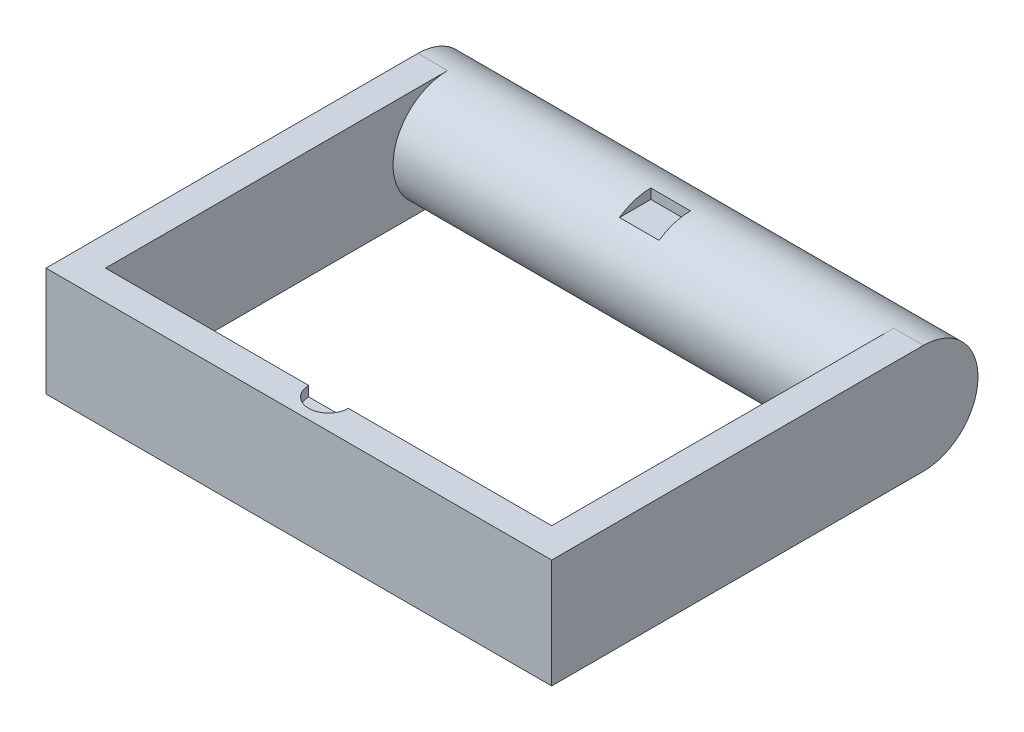
ISO-10303-21;
HEADER;
FILE_DESCRIPTION(('STEP AP214'),'2;1');
FILE_NAME('part.step','',(''),(''),'','','');
FILE_SCHEMA(('AUTOMOTIVE_DESIGN { 1 0 10303 214 1 1 1 1 }'));
ENDSEC;
DATA;
#1=APPLICATION_CONTEXT('core data for automotive mechanical design processes');
#2=APPLICATION_PROTOCOL_DEFINITION('international standard','automotive_design',2000,#1);
#3=PRODUCT_CONTEXT('',#1,'mechanical');
#4=PRODUCT('Part','Part','',(#3));
#5=PRODUCT_RELATED_PRODUCT_CATEGORY('part','',(#4));
#6=PRODUCT_DEFINITION_FORMATION('','',#4);
#7=PRODUCT_DEFINITION_CONTEXT('part definition',#1,'design');
#8=PRODUCT_DEFINITION('design','',#6,#7);
#9=PRODUCT_DEFINITION_SHAPE('','',#8);
#10=(LENGTH_UNIT() NAMED_UNIT(*) SI_UNIT(.MILLI.,.METRE.));
#11=(NAMED_UNIT(*) PLANE_ANGLE_UNIT() SI_UNIT($,.RADIAN.));
#12=(NAMED_UNIT(*) SI_UNIT($,.STERADIAN.) SOLID_ANGLE_UNIT());
#13=UNCERTAINTY_MEASURE_WITH_UNIT(LENGTH_MEASURE(1.E-05),#10,'distance_accuracy_value','');
#14=(GEOMETRIC_REPRESENTATION_CONTEXT(3) GLOBAL_UNCERTAINTY_ASSIGNED_CONTEXT((#13)) GLOBAL_UNIT_ASSIGNED_CONTEXT((#10,
#11,#12)) REPRESENTATION_CONTEXT('',''));
#15=CARTESIAN_POINT('',(0.,0.,0.));
#16=DIRECTION('',(0.,0.,1.));
#17=DIRECTION('',(1.,0.,0.));
#18=AXIS2_PLACEMENT_3D('',#15,#16,#17);
#19=CARTESIAN_POINT('',(22.5,0.,0.));
#20=DIRECTION('',(-1.,0.,0.));
#21=DIRECTION('',(0.,0.,-1.));
#22=AXIS2_PLACEMENT_3D('',#19,#20,#21);
#23=CYLINDRICAL_SURFACE('',#22,2.75);
#24=DIRECTION('',(-1.,0.,0.));
#25=VECTOR('',#24,1.);
#26=CARTESIAN_POINT('',(22.5,2.25,1.58113883008419));
#27=LINE('',#26,#25);
#28=CARTESIAN_POINT('',(10.25,2.25,1.58113883008418));
#29=VERTEX_POINT('',#28);
#30=CARTESIAN_POINT('',(12.25,2.25,1.58113883008418));
#31=VERTEX_POINT('',#30);
#32=EDGE_CURVE('E156',#29,#31,#27,.F.);
#33=ORIENTED_EDGE('',*,*,#32,.F.);
#34=CARTESIAN_POINT('',(10.25,0.,0.));
#35=DIRECTION('',(1.,0.,0.));
#36=DIRECTION('',(0.,0.,-1.));
#37=AXIS2_PLACEMENT_3D('',#34,#35,#36);
#38=CIRCLE('',#37,2.75);
#39=CARTESIAN_POINT('',(10.25,2.75,0.));
#40=VERTEX_POINT('',#39);
#41=EDGE_CURVE('E142',#40,#29,#38,.T.);
#42=ORIENTED_EDGE('',*,*,#41,.F.);
#43=DIRECTION('',(1.,0.,0.));
#44=VECTOR('',#43,1.);
#45=CARTESIAN_POINT('',(10.25,2.75,0.));
#46=LINE('',#45,#44);
#47=CARTESIAN_POINT('',(12.25,2.75,0.));
#48=VERTEX_POINT('',#47);
#49=EDGE_CURVE('E147',#40,#48,#46,.T.);
#50=ORIENTED_EDGE('',*,*,#49,.T.);
#51=CARTESIAN_POINT('',(12.25,0.,0.));
#52=DIRECTION('',(-1.,0.,0.));
#53=DIRECTION('',(0.,0.,1.));
#54=AXIS2_PLACEMENT_3D('',#51,#52,#53);
#55=CIRCLE('',#54,2.75);
#56=EDGE_CURVE('E159',#31,#48,#55,.T.);
#57=ORIENTED_EDGE('',*,*,#56,.F.);
#58=EDGE_LOOP('',(#33,#42,#50,#57));
#59=FACE_BOUND('',#58,.T.);
#60=CARTESIAN_POINT('',(22.5,0.,0.));
#61=DIRECTION('',(-1.,0.,0.));
#62=DIRECTION('',(0.,0.,1.));
#63=AXIS2_PLACEMENT_3D('',#60,#61,#62);
#64=CIRCLE('',#63,2.75);
#65=CARTESIAN_POINT('',(22.5,-2.75,0.));
#66=VERTEX_POINT('',#65);
#67=CARTESIAN_POINT('',(22.5,2.75,0.));
#68=VERTEX_POINT('',#67);
#69=EDGE_CURVE('E44',#66,#68,#64,.T.);
#70=ORIENTED_EDGE('',*,*,#69,.T.);
#71=DIRECTION('',(-1.,0.,0.));
#72=VECTOR('',#71,1.);
#73=CARTESIAN_POINT('',(24.,2.75,0.));
#74=LINE('',#73,#72);
#75=CARTESIAN_POINT('',(24.,2.75,0.));
#76=VERTEX_POINT('',#75);
#77=EDGE_CURVE('E197',#76,#68,#74,.T.);
#78=ORIENTED_EDGE('',*,*,#77,.F.);
#79=CARTESIAN_POINT('',(24.,0.,0.));
#80=DIRECTION('',(-1.,0.,0.));
#81=DIRECTION('',(0.,0.,1.));
#82=AXIS2_PLACEMENT_3D('',#79,#80,#81);
#83=CIRCLE('',#82,2.75);
#84=CARTESIAN_POINT('',(24.,-2.75,0.));
#85=VERTEX_POINT('',#84);
#86=EDGE_CURVE('E182',#76,#85,#83,.T.);
#87=ORIENTED_EDGE('',*,*,#86,.T.);
#88=DIRECTION('',(-1.,0.,0.));
#89=VECTOR('',#88,1.);
#90=CARTESIAN_POINT('',(24.,-2.75,0.));
#91=LINE('',#90,#89);
#92=EDGE_CURVE('E189',#85,#66,#91,.T.);
#93=ORIENTED_EDGE('',*,*,#92,.T.);
#94=EDGE_LOOP('',(#70,#78,#87,#93));
#95=FACE_BOUND('',#94,.T.);
#96=CARTESIAN_POINT('',(0.,0.,0.));
#97=DIRECTION('',(-1.,0.,0.));
#98=DIRECTION('',(0.,0.,1.));
#99=AXIS2_PLACEMENT_3D('',#96,#97,#98);
#100=CIRCLE('',#99,2.75);
#101=CARTESIAN_POINT('',(0.,-2.75,0.));
#102=VERTEX_POINT('',#101);
#103=CARTESIAN_POINT('',(0.,2.75,0.));
#104=VERTEX_POINT('',#103);
#105=EDGE_CURVE('E221',#102,#104,#100,.T.);
#106=ORIENTED_EDGE('',*,*,#105,.F.);
#107=DIRECTION('',(1.,0.,0.));
#108=VECTOR('',#107,1.);
#109=CARTESIAN_POINT('',(-1.5,-2.75,0.));
#110=LINE('',#109,#108);
#111=CARTESIAN_POINT('',(-1.5,-2.75,0.));
#112=VERTEX_POINT('',#111);
#113=EDGE_CURVE('E210',#112,#102,#110,.T.);
#114=ORIENTED_EDGE('',*,*,#113,.F.);
#115=CARTESIAN_POINT('',(-1.5,0.,0.));
#116=DIRECTION('',(1.,0.,0.));
#117=DIRECTION('',(0.,0.,-1.));
#118=AXIS2_PLACEMENT_3D('',#115,#116,#117);
#119=CIRCLE('',#118,2.75);
#120=CARTESIAN_POINT('',(-1.5,2.75,0.));
#121=VERTEX_POINT('',#120);
#122=EDGE_CURVE('E201',#112,#121,#119,.T.);
#123=ORIENTED_EDGE('',*,*,#122,.T.);
#124=DIRECTION('',(1.,0.,0.));
#125=VECTOR('',#124,1.);
#126=CARTESIAN_POINT('',(-1.5,2.75,0.));
#127=LINE('',#126,#125);
#128=EDGE_CURVE('E218',#121,#104,#127,.T.);
#129=ORIENTED_EDGE('',*,*,#128,.T.);
#130=EDGE_LOOP('',(#106,#114,#123,#129));
#131=FACE_BOUND('',#130,.T.);
#132=ADVANCED_FACE('F37',(#59,#95,#131),#23,.T.);
#133=CARTESIAN_POINT('',(-1.5,2.75,0.));
#134=DIRECTION('',(0.,-1.,0.));
#135=DIRECTION('',(0.,0.,1.));
#136=AXIS2_PLACEMENT_3D('',#133,#134,#135);
#137=PLANE('',#136);
#138=DIRECTION('',(1.,0.,0.));
#139=VECTOR('',#138,1.);
#140=CARTESIAN_POINT('',(24.,2.75,17.25));
#141=LINE('',#140,#139);
#142=CARTESIAN_POINT('',(0.,2.75,17.25));
#143=VERTEX_POINT('',#142);
#144=CARTESIAN_POINT('',(10.25,2.75,17.25));
#145=VERTEX_POINT('',#144);
#146=EDGE_CURVE('E166',#143,#145,#141,.T.);
#147=ORIENTED_EDGE('',*,*,#146,.F.);
#148=DIRECTION('',(0.,0.,1.));
#149=VECTOR('',#148,1.);
#150=CARTESIAN_POINT('',(0.,2.75,0.));
#151=LINE('',#150,#149);
#152=EDGE_CURVE('E200',#104,#143,#151,.T.);
#153=ORIENTED_EDGE('',*,*,#152,.F.);
#154=ORIENTED_EDGE('',*,*,#128,.F.);
#155=DIRECTION('',(0.,0.,1.));
#156=VECTOR('',#155,1.);
#157=CARTESIAN_POINT('',(-1.5,2.75,0.));
#158=LINE('',#157,#156);
#159=CARTESIAN_POINT('',(-1.5,2.75,18.75));
#160=VERTEX_POINT('',#159);
#161=EDGE_CURVE('E204',#121,#160,#158,.T.);
#162=ORIENTED_EDGE('',*,*,#161,.T.);
#163=DIRECTION('',(1.,0.,0.));
#164=VECTOR('',#163,1.);
#165=CARTESIAN_POINT('',(24.,2.75,18.75));
#166=LINE('',#165,#164);
#167=CARTESIAN_POINT('',(24.,2.75,18.75));
#168=VERTEX_POINT('',#167);
#169=EDGE_CURVE('E171',#160,#168,#166,.T.);
#170=ORIENTED_EDGE('',*,*,#169,.T.);
#171=DIRECTION('',(0.,0.,-1.));
#172=VECTOR('',#171,1.);
#173=CARTESIAN_POINT('',(24.,2.75,0.));
#174=LINE('',#173,#172);
#175=EDGE_CURVE('E180',#168,#76,#174,.T.);
#176=ORIENTED_EDGE('',*,*,#175,.T.);
#177=ORIENTED_EDGE('',*,*,#77,.T.);
#178=DIRECTION('',(0.,0.,-1.));
#179=VECTOR('',#178,1.);
#180=CARTESIAN_POINT('',(22.5,2.75,0.));
#181=LINE('',#180,#179);
#182=CARTESIAN_POINT('',(22.5,2.75,17.25));
#183=VERTEX_POINT('',#182);
#184=EDGE_CURVE('E191',#183,#68,#181,.T.);
#185=ORIENTED_EDGE('',*,*,#184,.F.);
#186=CARTESIAN_POINT('',(12.25,2.75,17.25));
#187=VERTEX_POINT('',#186);
#188=EDGE_CURVE('E177',#187,#183,#141,.T.);
#189=ORIENTED_EDGE('',*,*,#188,.F.);
#190=CARTESIAN_POINT('',(11.25,2.75,17.25));
#191=DIRECTION('',(0.,-1.,0.));
#192=DIRECTION('',(0.,0.,1.));
#193=AXIS2_PLACEMENT_3D('',#190,#191,#192);
#194=CIRCLE('',#193,1.);
#195=EDGE_CURVE('E238',#187,#145,#194,.T.);
#196=ORIENTED_EDGE('',*,*,#195,.T.);
#197=EDGE_LOOP('',(#147,#153,#154,#162,#170,#176,#177,#185,#189,#196));
#198=FACE_BOUND('',#197,.T.);
#199=ADVANCED_FACE('F234',(#198),#137,.F.);
#200=CARTESIAN_POINT('',(-1.5,-2.75,0.));
#201=DIRECTION('',(0.,1.,0.));
#202=DIRECTION('',(0.,0.,-1.));
#203=AXIS2_PLACEMENT_3D('',#200,#201,#202);
#204=PLANE('',#203);
#205=DIRECTION('',(0.,0.,-1.));
#206=VECTOR('',#205,1.);
#207=CARTESIAN_POINT('',(0.,-2.75,0.));
#208=LINE('',#207,#206);
#209=CARTESIAN_POINT('',(0.,-2.75,17.25));
#210=VERTEX_POINT('',#209);
#211=EDGE_CURVE('E205',#210,#102,#208,.T.);
#212=ORIENTED_EDGE('',*,*,#211,.F.);
#213=DIRECTION('',(-1.,0.,0.));
#214=VECTOR('',#213,1.);
#215=CARTESIAN_POINT('',(24.,-2.75,17.25));
#216=LINE('',#215,#214);
#217=CARTESIAN_POINT('',(22.5,-2.75,17.25));
#218=VERTEX_POINT('',#217);
#219=EDGE_CURVE('E162',#218,#210,#216,.T.);
#220=ORIENTED_EDGE('',*,*,#219,.F.);
#221=DIRECTION('',(0.,0.,1.));
#222=VECTOR('',#221,1.);
#223=CARTESIAN_POINT('',(22.5,-2.75,0.));
#224=LINE('',#223,#222);
#225=EDGE_CURVE('E183',#66,#218,#224,.T.);
#226=ORIENTED_EDGE('',*,*,#225,.F.);
#227=ORIENTED_EDGE('',*,*,#92,.F.);
#228=DIRECTION('',(0.,0.,1.));
#229=VECTOR('',#228,1.);
#230=CARTESIAN_POINT('',(24.,-2.75,0.));
#231=LINE('',#230,#229);
#232=CARTESIAN_POINT('',(24.,-2.75,18.75));
#233=VERTEX_POINT('',#232);
#234=EDGE_CURVE('E186',#85,#233,#231,.T.);
#235=ORIENTED_EDGE('',*,*,#234,.T.);
#236=DIRECTION('',(-1.,0.,0.));
#237=VECTOR('',#236,1.);
#238=CARTESIAN_POINT('',(24.,-2.75,18.75));
#239=LINE('',#238,#237);
#240=CARTESIAN_POINT('',(-1.5,-2.75,18.75));
#241=VERTEX_POINT('',#240);
#242=EDGE_CURVE('E165',#233,#241,#239,.T.);
#243=ORIENTED_EDGE('',*,*,#242,.T.);
#244=DIRECTION('',(0.,0.,-1.));
#245=VECTOR('',#244,1.);
#246=CARTESIAN_POINT('',(-1.5,-2.75,0.));
#247=LINE('',#246,#245);
#248=EDGE_CURVE('E208',#241,#112,#247,.T.);
#249=ORIENTED_EDGE('',*,*,#248,.T.);
#250=ORIENTED_EDGE('',*,*,#113,.T.);
#251=EDGE_LOOP('',(#212,#220,#226,#227,#235,#243,#249,#250));
#252=FACE_BOUND('',#251,.T.);
#253=ADVANCED_FACE('F245',(#252),#204,.F.);
#254=CARTESIAN_POINT('',(-1.5,0.,0.));
#255=DIRECTION('',(-1.,0.,0.));
#256=DIRECTION('',(0.,0.,-1.));
#257=AXIS2_PLACEMENT_3D('',#254,#255,#256);
#258=PLANE('',#257);
#259=ORIENTED_EDGE('',*,*,#122,.F.);
#260=ORIENTED_EDGE('',*,*,#248,.F.);
#261=DIRECTION('',(0.,1.,0.));
#262=VECTOR('',#261,1.);
#263=CARTESIAN_POINT('',(-1.5,-2.75,18.75));
#264=LINE('',#263,#262);
#265=EDGE_CURVE('E169',#241,#160,#264,.T.);
#266=ORIENTED_EDGE('',*,*,#265,.T.);
#267=ORIENTED_EDGE('',*,*,#161,.F.);
#268=EDGE_LOOP('',(#259,#260,#266,#267));
#269=FACE_BOUND('',#268,.T.);
#270=ADVANCED_FACE('F249',(#269),#258,.T.);
#271=CARTESIAN_POINT('',(0.,0.,0.));
#272=DIRECTION('',(-1.,0.,0.));
#273=DIRECTION('',(0.,0.,-1.));
#274=AXIS2_PLACEMENT_3D('',#271,#272,#273);
#275=PLANE('',#274);
#276=ORIENTED_EDGE('',*,*,#105,.T.);
#277=ORIENTED_EDGE('',*,*,#152,.T.);
#278=DIRECTION('',(0.,-1.,0.));
#279=VECTOR('',#278,1.);
#280=CARTESIAN_POINT('',(0.,2.75,17.25));
#281=LINE('',#280,#279);
#282=EDGE_CURVE('E213',#143,#210,#281,.T.);
#283=ORIENTED_EDGE('',*,*,#282,.T.);
#284=ORIENTED_EDGE('',*,*,#211,.T.);
#285=EDGE_LOOP('',(#276,#277,#283,#284));
#286=FACE_BOUND('',#285,.T.);
#287=ADVANCED_FACE('F226',(#286),#275,.F.);
#288=CARTESIAN_POINT('',(22.5,0.,0.));
#289=DIRECTION('',(1.,0.,0.));
#290=DIRECTION('',(0.,0.,1.));
#291=AXIS2_PLACEMENT_3D('',#288,#289,#290);
#292=PLANE('',#291);
#293=ORIENTED_EDGE('',*,*,#225,.T.);
#294=DIRECTION('',(0.,1.,0.));
#295=VECTOR('',#294,1.);
#296=CARTESIAN_POINT('',(22.5,-2.75,17.25));
#297=LINE('',#296,#295);
#298=EDGE_CURVE('E174',#218,#183,#297,.T.);
#299=ORIENTED_EDGE('',*,*,#298,.T.);
#300=ORIENTED_EDGE('',*,*,#184,.T.);
#301=ORIENTED_EDGE('',*,*,#69,.F.);
#302=EDGE_LOOP('',(#293,#299,#300,#301));
#303=FACE_BOUND('',#302,.T.);
#304=ADVANCED_FACE('F263',(#303),#292,.F.);
#305=CARTESIAN_POINT('',(24.,0.,0.));
#306=DIRECTION('',(1.,0.,0.));
#307=DIRECTION('',(0.,0.,1.));
#308=AXIS2_PLACEMENT_3D('',#305,#306,#307);
#309=PLANE('',#308);
#310=ORIENTED_EDGE('',*,*,#234,.F.);
#311=ORIENTED_EDGE('',*,*,#86,.F.);
#312=ORIENTED_EDGE('',*,*,#175,.F.);
#313=DIRECTION('',(0.,-1.,0.));
#314=VECTOR('',#313,1.);
#315=CARTESIAN_POINT('',(24.,-2.75,18.75));
#316=LINE('',#315,#314);
#317=EDGE_CURVE('E163',#168,#233,#316,.T.);
#318=ORIENTED_EDGE('',*,*,#317,.T.);
#319=EDGE_LOOP('',(#310,#311,#312,#318));
#320=FACE_BOUND('',#319,.T.);
#321=ADVANCED_FACE('F258',(#320),#309,.T.);
#322=CARTESIAN_POINT('',(0.,0.,18.75));
#323=DIRECTION('',(0.,0.,-1.));
#324=DIRECTION('',(1.,0.,0.));
#325=AXIS2_PLACEMENT_3D('',#322,#323,#324);
#326=PLANE('',#325);
#327=ORIENTED_EDGE('',*,*,#317,.F.);
#328=ORIENTED_EDGE('',*,*,#169,.F.);
#329=ORIENTED_EDGE('',*,*,#265,.F.);
#330=ORIENTED_EDGE('',*,*,#242,.F.);
#331=EDGE_LOOP('',(#327,#328,#329,#330));
#332=FACE_BOUND('',#331,.T.);
#333=ADVANCED_FACE('F252',(#332),#326,.F.);
#334=CARTESIAN_POINT('',(0.,0.,17.25));
#335=DIRECTION('',(0.,0.,-1.));
#336=DIRECTION('',(1.,0.,0.));
#337=AXIS2_PLACEMENT_3D('',#334,#335,#336);
#338=PLANE('',#337);
#339=DIRECTION('',(0.,1.,0.));
#340=VECTOR('',#339,1.);
#341=CARTESIAN_POINT('',(12.25,2.25,17.25));
#342=LINE('',#341,#340);
#343=CARTESIAN_POINT('',(12.25,2.25,17.25));
#344=VERTEX_POINT('',#343);
#345=EDGE_CURVE('E151',#344,#187,#342,.T.);
#346=ORIENTED_EDGE('',*,*,#345,.T.);
#347=ORIENTED_EDGE('',*,*,#188,.T.);
#348=ORIENTED_EDGE('',*,*,#298,.F.);
#349=ORIENTED_EDGE('',*,*,#219,.T.);
#350=ORIENTED_EDGE('',*,*,#282,.F.);
#351=ORIENTED_EDGE('',*,*,#146,.T.);
#352=DIRECTION('',(0.,1.,0.));
#353=VECTOR('',#352,1.);
#354=CARTESIAN_POINT('',(10.25,2.25,17.25));
#355=LINE('',#354,#353);
#356=CARTESIAN_POINT('',(10.25,2.25,17.25));
#357=VERTEX_POINT('',#356);
#358=EDGE_CURVE('E149',#357,#145,#355,.T.);
#359=ORIENTED_EDGE('',*,*,#358,.F.);
#360=DIRECTION('',(1.,0.,0.));
#361=VECTOR('',#360,1.);
#362=CARTESIAN_POINT('',(0.,2.25,17.25));
#363=LINE('',#362,#361);
#364=EDGE_CURVE('E11',#357,#344,#363,.T.);
#365=ORIENTED_EDGE('',*,*,#364,.T.);
#366=EDGE_LOOP('',(#346,#347,#348,#349,#350,#351,#359,#365));
#367=FACE_BOUND('',#366,.T.);
#368=ADVANCED_FACE('F241',(#367),#338,.T.);
#369=CARTESIAN_POINT('',(11.25,2.25,17.25));
#370=DIRECTION('',(0.,-1.,0.));
#371=DIRECTION('',(0.,0.,1.));
#372=AXIS2_PLACEMENT_3D('',#369,#370,#371);
#373=PLANE('',#372);
#374=ORIENTED_EDGE('',*,*,#364,.F.);
#375=CARTESIAN_POINT('',(11.25,2.25,17.25));
#376=DIRECTION('',(0.,-1.,0.));
#377=DIRECTION('',(0.,0.,1.));
#378=AXIS2_PLACEMENT_3D('',#375,#376,#377);
#379=CIRCLE('',#378,1.);
#380=EDGE_CURVE('E59',#344,#357,#379,.T.);
#381=ORIENTED_EDGE('',*,*,#380,.F.);
#382=EDGE_LOOP('',(#374,#381));
#383=FACE_BOUND('',#382,.T.);
#384=ADVANCED_FACE('F292',(#383),#373,.F.);
#385=CARTESIAN_POINT('',(11.25,2.25,17.25));
#386=DIRECTION('',(0.,1.,0.));
#387=DIRECTION('',(0.,0.,-1.));
#388=AXIS2_PLACEMENT_3D('',#385,#386,#387);
#389=CYLINDRICAL_SURFACE('',#388,1.);
#390=ORIENTED_EDGE('',*,*,#195,.F.);
#391=ORIENTED_EDGE('',*,*,#345,.F.);
#392=ORIENTED_EDGE('',*,*,#380,.T.);
#393=ORIENTED_EDGE('',*,*,#358,.T.);
#394=EDGE_LOOP('',(#390,#391,#392,#393));
#395=FACE_BOUND('',#394,.T.);
#396=ADVANCED_FACE('F264',(#395),#389,.F.);
#397=CARTESIAN_POINT('',(12.25,2.25,17.25));
#398=DIRECTION('',(1.,0.,0.));
#399=DIRECTION('',(0.,0.,1.));
#400=AXIS2_PLACEMENT_3D('',#397,#398,#399);
#401=PLANE('',#400);
#402=DIRECTION('',(0.,0.,1.));
#403=VECTOR('',#402,1.);
#404=CARTESIAN_POINT('',(12.25,2.25,17.25));
#405=LINE('',#404,#403);
#406=CARTESIAN_POINT('',(12.25,2.25,0.));
#407=VERTEX_POINT('',#406);
#408=EDGE_CURVE('E136',#407,#31,#405,.T.);
#409=ORIENTED_EDGE('',*,*,#408,.T.);
#410=ORIENTED_EDGE('',*,*,#56,.T.);
#411=DIRECTION('',(0.,1.,0.));
#412=VECTOR('',#411,1.);
#413=CARTESIAN_POINT('',(12.25,2.25,0.));
#414=LINE('',#413,#412);
#415=EDGE_CURVE('E148',#407,#48,#414,.T.);
#416=ORIENTED_EDGE('',*,*,#415,.F.);
#417=EDGE_LOOP('',(#409,#410,#416));
#418=FACE_BOUND('',#417,.T.);
#419=ADVANCED_FACE('F271',(#418),#401,.F.);
#420=CARTESIAN_POINT('',(10.25,2.25,17.25));
#421=DIRECTION('',(-1.,0.,0.));
#422=DIRECTION('',(0.,0.,-1.));
#423=AXIS2_PLACEMENT_3D('',#420,#421,#422);
#424=PLANE('',#423);
#425=DIRECTION('',(0.,1.,0.));
#426=VECTOR('',#425,1.);
#427=CARTESIAN_POINT('',(10.25,2.25,0.));
#428=LINE('',#427,#426);
#429=CARTESIAN_POINT('',(10.25,2.25,0.));
#430=VERTEX_POINT('',#429);
#431=EDGE_CURVE('E51',#430,#40,#428,.T.);
#432=ORIENTED_EDGE('',*,*,#431,.T.);
#433=ORIENTED_EDGE('',*,*,#41,.T.);
#434=DIRECTION('',(0.,0.,-1.));
#435=VECTOR('',#434,1.);
#436=CARTESIAN_POINT('',(10.25,2.25,17.25));
#437=LINE('',#436,#435);
#438=EDGE_CURVE('E135',#29,#430,#437,.T.);
#439=ORIENTED_EDGE('',*,*,#438,.T.);
#440=EDGE_LOOP('',(#432,#433,#439));
#441=FACE_BOUND('',#440,.T.);
#442=ADVANCED_FACE('F140',(#441),#424,.F.);
#443=ORIENTED_EDGE('',*,*,#438,.F.);
#444=ORIENTED_EDGE('',*,*,#32,.T.);
#445=ORIENTED_EDGE('',*,*,#408,.F.);
#446=DIRECTION('',(1.,0.,0.));
#447=VECTOR('',#446,1.);
#448=CARTESIAN_POINT('',(10.25,2.25,0.));
#449=LINE('',#448,#447);
#450=EDGE_CURVE('E132',#430,#407,#449,.T.);
#451=ORIENTED_EDGE('',*,*,#450,.F.);
#452=EDGE_LOOP('',(#443,#444,#445,#451));
#453=FACE_BOUND('',#452,.T.);
#454=ADVANCED_FACE('F133',(#453),#373,.F.);
#455=CARTESIAN_POINT('',(10.25,2.25,0.));
#456=DIRECTION('',(0.,0.,-1.));
#457=DIRECTION('',(1.,0.,0.));
#458=AXIS2_PLACEMENT_3D('',#455,#456,#457);
#459=PLANE('',#458);
#460=ORIENTED_EDGE('',*,*,#49,.F.);
#461=ORIENTED_EDGE('',*,*,#431,.F.);
#462=ORIENTED_EDGE('',*,*,#450,.T.);
#463=ORIENTED_EDGE('',*,*,#415,.T.);
#464=EDGE_LOOP('',(#460,#461,#462,#463));
#465=FACE_BOUND('',#464,.T.);
#466=ADVANCED_FACE('F145',(#465),#459,.F.);
#467=CLOSED_SHELL('',(#132,#199,#253,#270,#287,#304,#321,#333,#368,#384,#396,#419,#442,#454,#466));
#468=MANIFOLD_SOLID_BREP('B2',#467);
#469=ADVANCED_BREP_SHAPE_REPRESENTATION('',(#18,#468),#14);
#470=SHAPE_DEFINITION_REPRESENTATION(#9,#469);
ENDSEC;
END-ISO-10303-21;
